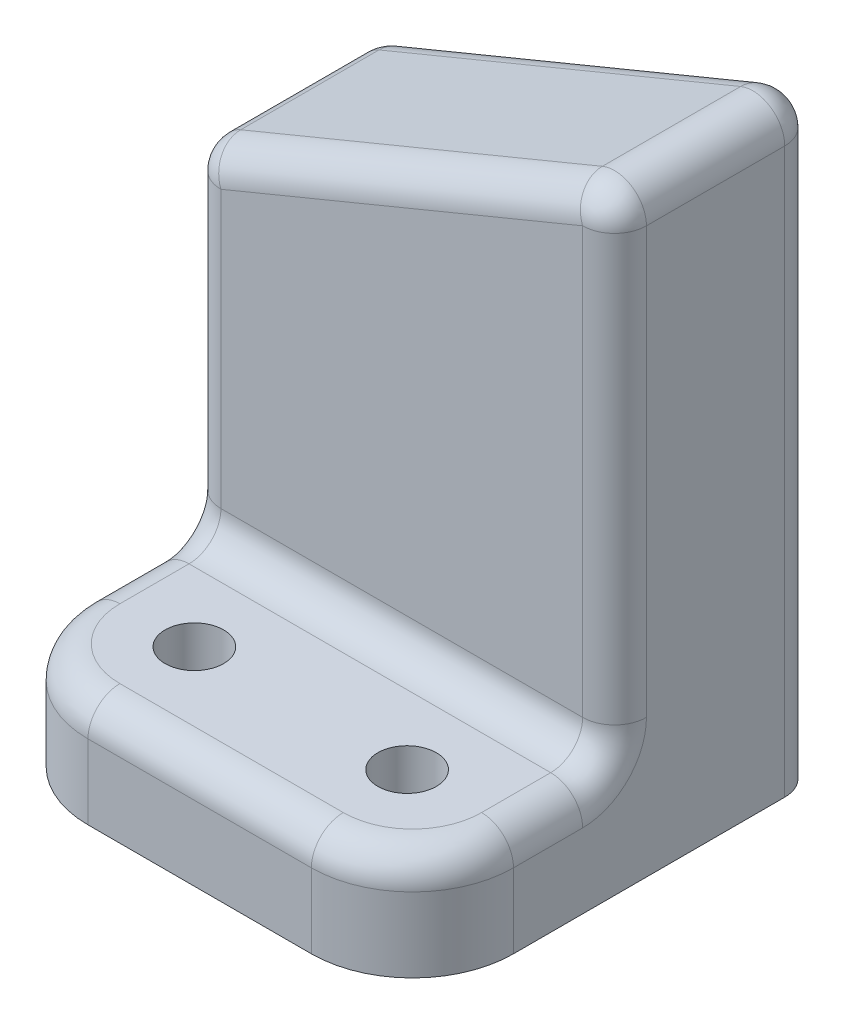
ISO-10303-21;
HEADER;
FILE_DESCRIPTION(('STEP AP214'),'2;1');
FILE_NAME('part.step','',(''),(''),'','','');
FILE_SCHEMA(('AUTOMOTIVE_DESIGN { 1 0 10303 214 1 1 1 1 }'));
ENDSEC;
DATA;
#1=APPLICATION_CONTEXT('core data for automotive mechanical design processes');
#2=APPLICATION_PROTOCOL_DEFINITION('international standard','automotive_design',2000,#1);
#3=PRODUCT_CONTEXT('',#1,'mechanical');
#4=PRODUCT('Part','Part','',(#3));
#5=PRODUCT_RELATED_PRODUCT_CATEGORY('part','',(#4));
#6=PRODUCT_DEFINITION_FORMATION('','',#4);
#7=PRODUCT_DEFINITION_CONTEXT('part definition',#1,'design');
#8=PRODUCT_DEFINITION('design','',#6,#7);
#9=PRODUCT_DEFINITION_SHAPE('','',#8);
#10=(LENGTH_UNIT() NAMED_UNIT(*) SI_UNIT(.MILLI.,.METRE.));
#11=(NAMED_UNIT(*) PLANE_ANGLE_UNIT() SI_UNIT($,.RADIAN.));
#12=(NAMED_UNIT(*) SI_UNIT($,.STERADIAN.) SOLID_ANGLE_UNIT());
#13=UNCERTAINTY_MEASURE_WITH_UNIT(LENGTH_MEASURE(1.E-05),#10,'distance_accuracy_value','');
#14=(GEOMETRIC_REPRESENTATION_CONTEXT(3) GLOBAL_UNCERTAINTY_ASSIGNED_CONTEXT((#13)) GLOBAL_UNIT_ASSIGNED_CONTEXT((#10,
#11,#12)) REPRESENTATION_CONTEXT('',''));
#15=CARTESIAN_POINT('',(0.,0.,0.));
#16=DIRECTION('',(0.,0.,1.));
#17=DIRECTION('',(1.,0.,0.));
#18=AXIS2_PLACEMENT_3D('',#15,#16,#17);
#19=CARTESIAN_POINT('',(20.,10.,19.));
#20=DIRECTION('',(0.,-1.,0.));
#21=DIRECTION('',(0.,0.,-1.));
#22=AXIS2_PLACEMENT_3D('',#19,#20,#21);
#23=PLANE('',#22);
#24=DIRECTION('',(-1.,0.,0.));
#25=VECTOR('',#24,1.);
#26=CARTESIAN_POINT('',(-20.,10.,22.));
#27=LINE('',#26,#25);
#28=CARTESIAN_POINT('',(17.,10.,22.));
#29=VERTEX_POINT('',#28);
#30=CARTESIAN_POINT('',(-17.,10.,22.));
#31=VERTEX_POINT('',#30);
#32=EDGE_CURVE('E215',#29,#31,#27,.T.);
#33=ORIENTED_EDGE('',*,*,#32,.T.);
#34=DIRECTION('',(0.,0.,1.));
#35=VECTOR('',#34,1.);
#36=CARTESIAN_POINT('',(-17.,10.,19.));
#37=LINE('',#36,#35);
#38=CARTESIAN_POINT('',(-17.,10.,28.5));
#39=VERTEX_POINT('',#38);
#40=EDGE_CURVE('E258',#31,#39,#37,.T.);
#41=ORIENTED_EDGE('',*,*,#40,.T.);
#42=CARTESIAN_POINT('',(-10.5,10.,28.5));
#43=DIRECTION('',(0.,-1.,0.));
#44=DIRECTION('',(0.,0.,-1.));
#45=AXIS2_PLACEMENT_3D('',#42,#43,#44);
#46=CIRCLE('',#45,6.5);
#47=CARTESIAN_POINT('',(-10.5,10.,35.));
#48=VERTEX_POINT('',#47);
#49=EDGE_CURVE('E256',#39,#48,#46,.F.);
#50=ORIENTED_EDGE('',*,*,#49,.T.);
#51=DIRECTION('',(-1.,0.,0.));
#52=VECTOR('',#51,1.);
#53=CARTESIAN_POINT('',(20.,10.,35.));
#54=LINE('',#53,#52);
#55=CARTESIAN_POINT('',(10.5,10.,35.));
#56=VERTEX_POINT('',#55);
#57=EDGE_CURVE('E254',#48,#56,#54,.F.);
#58=ORIENTED_EDGE('',*,*,#57,.T.);
#59=CARTESIAN_POINT('',(10.5,10.,28.5));
#60=DIRECTION('',(0.,-1.,0.));
#61=DIRECTION('',(0.,0.,-1.));
#62=AXIS2_PLACEMENT_3D('',#59,#60,#61);
#63=CIRCLE('',#62,6.5);
#64=CARTESIAN_POINT('',(17.,10.,28.5));
#65=VERTEX_POINT('',#64);
#66=EDGE_CURVE('E252',#56,#65,#63,.F.);
#67=ORIENTED_EDGE('',*,*,#66,.T.);
#68=DIRECTION('',(0.,0.,1.));
#69=VECTOR('',#68,1.);
#70=CARTESIAN_POINT('',(17.,10.,22.));
#71=LINE('',#70,#69);
#72=EDGE_CURVE('E250',#65,#29,#71,.F.);
#73=ORIENTED_EDGE('',*,*,#72,.T.);
#74=EDGE_LOOP('',(#33,#41,#50,#58,#67,#73));
#75=FACE_BOUND('',#74,.T.);
#76=CARTESIAN_POINT('',(10.,10.,28.5));
#77=DIRECTION('',(0.,1.,0.));
#78=DIRECTION('',(0.,0.,1.));
#79=AXIS2_PLACEMENT_3D('',#76,#77,#78);
#80=CIRCLE('',#79,2.75);
#81=CARTESIAN_POINT('',(10.,10.,31.25));
#82=VERTEX_POINT('',#81);
#83=EDGE_CURVE('E503',#82,#82,#80,.T.);
#84=ORIENTED_EDGE('',*,*,#83,.F.);
#85=EDGE_LOOP('',(#84));
#86=FACE_BOUND('',#85,.T.);
#87=CARTESIAN_POINT('',(-10.,10.,28.5));
#88=DIRECTION('',(0.,1.,0.));
#89=DIRECTION('',(0.,0.,1.));
#90=AXIS2_PLACEMENT_3D('',#87,#88,#89);
#91=CIRCLE('',#90,2.75);
#92=CARTESIAN_POINT('',(-10.,10.,31.25));
#93=VERTEX_POINT('',#92);
#94=EDGE_CURVE('E509',#93,#93,#91,.T.);
#95=ORIENTED_EDGE('',*,*,#94,.F.);
#96=EDGE_LOOP('',(#95));
#97=FACE_BOUND('',#96,.T.);
#98=ADVANCED_FACE('F34',(#75,#86,#97),#23,.F.);
#99=CARTESIAN_POINT('',(20.,0.,38.));
#100=DIRECTION('',(0.,1.,0.));
#101=DIRECTION('',(0.,0.,1.));
#102=AXIS2_PLACEMENT_3D('',#99,#100,#101);
#103=PLANE('',#102);
#104=CARTESIAN_POINT('',(-10.,0.,28.5));
#105=DIRECTION('',(0.,1.,0.));
#106=DIRECTION('',(0.,0.,1.));
#107=AXIS2_PLACEMENT_3D('',#104,#105,#106);
#108=CIRCLE('',#107,2.75);
#109=CARTESIAN_POINT('',(-10.,0.,31.25));
#110=VERTEX_POINT('',#109);
#111=EDGE_CURVE('E506',#110,#110,#108,.T.);
#112=ORIENTED_EDGE('',*,*,#111,.T.);
#113=EDGE_LOOP('',(#112));
#114=FACE_BOUND('',#113,.T.);
#115=CARTESIAN_POINT('',(10.,0.,28.5));
#116=DIRECTION('',(0.,1.,0.));
#117=DIRECTION('',(0.,0.,1.));
#118=AXIS2_PLACEMENT_3D('',#115,#116,#117);
#119=CIRCLE('',#118,2.75);
#120=CARTESIAN_POINT('',(10.,0.,31.25));
#121=VERTEX_POINT('',#120);
#122=EDGE_CURVE('E316',#121,#121,#119,.T.);
#123=ORIENTED_EDGE('',*,*,#122,.T.);
#124=EDGE_LOOP('',(#123));
#125=FACE_BOUND('',#124,.T.);
#126=DIRECTION('',(0.,0.,-1.));
#127=VECTOR('',#126,1.);
#128=CARTESIAN_POINT('',(-20.,0.,38.));
#129=LINE('',#128,#127);
#130=CARTESIAN_POINT('',(-20.,0.,28.5));
#131=VERTEX_POINT('',#130);
#132=CARTESIAN_POINT('',(-20.,0.,3.));
#133=VERTEX_POINT('',#132);
#134=EDGE_CURVE('E313',#131,#133,#129,.T.);
#135=ORIENTED_EDGE('',*,*,#134,.T.);
#136=CARTESIAN_POINT('',(-17.,0.,3.));
#137=DIRECTION('',(0.,1.,0.));
#138=DIRECTION('',(0.,0.,1.));
#139=AXIS2_PLACEMENT_3D('',#136,#137,#138);
#140=CIRCLE('',#139,3.);
#141=CARTESIAN_POINT('',(-17.,0.,0.));
#142=VERTEX_POINT('',#141);
#143=EDGE_CURVE('E11',#133,#142,#140,.F.);
#144=ORIENTED_EDGE('',*,*,#143,.T.);
#145=DIRECTION('',(-1.,0.,0.));
#146=VECTOR('',#145,1.);
#147=CARTESIAN_POINT('',(20.,0.,0.));
#148=LINE('',#147,#146);
#149=CARTESIAN_POINT('',(17.,0.,0.));
#150=VERTEX_POINT('',#149);
#151=EDGE_CURVE('E184',#150,#142,#148,.T.);
#152=ORIENTED_EDGE('',*,*,#151,.F.);
#153=CARTESIAN_POINT('',(17.,0.,3.));
#154=DIRECTION('',(0.,1.,0.));
#155=DIRECTION('',(0.,0.,1.));
#156=AXIS2_PLACEMENT_3D('',#153,#154,#155);
#157=CIRCLE('',#156,3.);
#158=CARTESIAN_POINT('',(20.,0.,3.));
#159=VERTEX_POINT('',#158);
#160=EDGE_CURVE('E43',#150,#159,#157,.F.);
#161=ORIENTED_EDGE('',*,*,#160,.T.);
#162=DIRECTION('',(0.,0.,-1.));
#163=VECTOR('',#162,1.);
#164=CARTESIAN_POINT('',(20.,0.,38.));
#165=LINE('',#164,#163);
#166=CARTESIAN_POINT('',(20.,0.,28.5));
#167=VERTEX_POINT('',#166);
#168=EDGE_CURVE('E170',#167,#159,#165,.T.);
#169=ORIENTED_EDGE('',*,*,#168,.F.);
#170=CARTESIAN_POINT('',(10.5,0.,28.5));
#171=DIRECTION('',(0.,1.,0.));
#172=DIRECTION('',(0.,0.,1.));
#173=AXIS2_PLACEMENT_3D('',#170,#171,#172);
#174=CIRCLE('',#173,9.5);
#175=CARTESIAN_POINT('',(10.5,0.,38.));
#176=VERTEX_POINT('',#175);
#177=EDGE_CURVE('E164',#167,#176,#174,.F.);
#178=ORIENTED_EDGE('',*,*,#177,.T.);
#179=DIRECTION('',(-1.,0.,0.));
#180=VECTOR('',#179,1.);
#181=CARTESIAN_POINT('',(20.,0.,38.));
#182=LINE('',#181,#180);
#183=CARTESIAN_POINT('',(-10.5,0.,38.));
#184=VERTEX_POINT('',#183);
#185=EDGE_CURVE('E168',#176,#184,#182,.T.);
#186=ORIENTED_EDGE('',*,*,#185,.T.);
#187=CARTESIAN_POINT('',(-10.5,0.,28.5));
#188=DIRECTION('',(0.,1.,0.));
#189=DIRECTION('',(0.,0.,1.));
#190=AXIS2_PLACEMENT_3D('',#187,#188,#189);
#191=CIRCLE('',#190,9.5);
#192=EDGE_CURVE('E174',#184,#131,#191,.F.);
#193=ORIENTED_EDGE('',*,*,#192,.T.);
#194=EDGE_LOOP('',(#135,#144,#152,#161,#169,#178,#186,#193));
#195=FACE_BOUND('',#194,.T.);
#196=ADVANCED_FACE('F167',(#114,#125,#195),#103,.F.);
#197=CARTESIAN_POINT('',(20.,0.,0.));
#198=DIRECTION('',(0.,0.,1.));
#199=DIRECTION('',(0.,-1.,0.));
#200=AXIS2_PLACEMENT_3D('',#197,#198,#199);
#201=PLANE('',#200);
#202=ORIENTED_EDGE('',*,*,#151,.T.);
#203=DIRECTION('',(0.,1.,0.));
#204=VECTOR('',#203,1.);
#205=CARTESIAN_POINT('',(-17.,0.,0.));
#206=LINE('',#205,#204);
#207=CARTESIAN_POINT('',(-17.,38.99228718,0.));
#208=VERTEX_POINT('',#207);
#209=EDGE_CURVE('E276',#142,#208,#206,.T.);
#210=ORIENTED_EDGE('',*,*,#209,.T.);
#211=DIRECTION('',(-0.924438601097928,-0.381330922952895,0.));
#212=VECTOR('',#211,1.);
#213=CARTESIAN_POINT('',(0.874263832928299,46.3654210110829,0.));
#214=LINE('',#213,#212);
#215=CARTESIAN_POINT('',(17.,53.01728718,0.));
#216=VERTEX_POINT('',#215);
#217=EDGE_CURVE('E59',#208,#216,#214,.F.);
#218=ORIENTED_EDGE('',*,*,#217,.T.);
#219=DIRECTION('',(0.,1.,0.));
#220=VECTOR('',#219,1.);
#221=CARTESIAN_POINT('',(17.,0.,0.));
#222=LINE('',#221,#220);
#223=EDGE_CURVE('E273',#216,#150,#222,.F.);
#224=ORIENTED_EDGE('',*,*,#223,.T.);
#225=EDGE_LOOP('',(#202,#210,#218,#224));
#226=FACE_BOUND('',#225,.T.);
#227=ADVANCED_FACE('F331',(#226),#201,.F.);
#228=CARTESIAN_POINT('',(20.,60.,19.));
#229=DIRECTION('',(0.,0.,-1.));
#230=DIRECTION('',(0.,1.,0.));
#231=AXIS2_PLACEMENT_3D('',#228,#229,#230);
#232=PLANE('',#231);
#233=DIRECTION('',(0.924438601097928,0.381330922952895,0.));
#234=VECTOR('',#233,1.);
#235=CARTESIAN_POINT('',(22.0252853311257,55.0902173790893,19.));
#236=LINE('',#235,#234);
#237=CARTESIAN_POINT('',(17.,53.01728718,19.));
#238=VERTEX_POINT('',#237);
#239=CARTESIAN_POINT('',(-17.,38.99228718,19.));
#240=VERTEX_POINT('',#239);
#241=EDGE_CURVE('E229',#238,#240,#236,.F.);
#242=ORIENTED_EDGE('',*,*,#241,.T.);
#243=DIRECTION('',(0.,-1.,0.));
#244=VECTOR('',#243,1.);
#245=CARTESIAN_POINT('',(-17.,60.,19.));
#246=LINE('',#245,#244);
#247=CARTESIAN_POINT('',(-17.,13.,19.));
#248=VERTEX_POINT('',#247);
#249=EDGE_CURVE('E232',#240,#248,#246,.T.);
#250=ORIENTED_EDGE('',*,*,#249,.T.);
#251=DIRECTION('',(-1.,0.,0.));
#252=VECTOR('',#251,1.);
#253=CARTESIAN_POINT('',(20.,13.,19.));
#254=LINE('',#253,#252);
#255=CARTESIAN_POINT('',(17.,13.,19.));
#256=VERTEX_POINT('',#255);
#257=EDGE_CURVE('E203',#248,#256,#254,.F.);
#258=ORIENTED_EDGE('',*,*,#257,.T.);
#259=DIRECTION('',(0.,-1.,0.));
#260=VECTOR('',#259,1.);
#261=CARTESIAN_POINT('',(17.,53.01728718,19.));
#262=LINE('',#261,#260);
#263=EDGE_CURVE('E227',#256,#238,#262,.F.);
#264=ORIENTED_EDGE('',*,*,#263,.T.);
#265=EDGE_LOOP('',(#242,#250,#258,#264));
#266=FACE_BOUND('',#265,.T.);
#267=ADVANCED_FACE('F360',(#266),#232,.F.);
#268=CARTESIAN_POINT('',(20.,10.,38.));
#269=DIRECTION('',(0.,0.,-1.));
#270=DIRECTION('',(-1.,0.,0.));
#271=AXIS2_PLACEMENT_3D('',#268,#269,#270);
#272=PLANE('',#271);
#273=DIRECTION('',(0.,-1.,0.));
#274=VECTOR('',#273,1.);
#275=CARTESIAN_POINT('',(10.5,10.,38.));
#276=LINE('',#275,#274);
#277=CARTESIAN_POINT('',(10.5,7.,38.));
#278=VERTEX_POINT('',#277);
#279=EDGE_CURVE('E180',#176,#278,#276,.F.);
#280=ORIENTED_EDGE('',*,*,#279,.T.);
#281=DIRECTION('',(-1.,0.,0.));
#282=VECTOR('',#281,1.);
#283=CARTESIAN_POINT('',(20.,7.,38.));
#284=LINE('',#283,#282);
#285=CARTESIAN_POINT('',(-10.5,7.,38.));
#286=VERTEX_POINT('',#285);
#287=EDGE_CURVE('E262',#278,#286,#284,.T.);
#288=ORIENTED_EDGE('',*,*,#287,.T.);
#289=DIRECTION('',(0.,-1.,0.));
#290=VECTOR('',#289,1.);
#291=CARTESIAN_POINT('',(-10.5,10.,38.));
#292=LINE('',#291,#290);
#293=EDGE_CURVE('E175',#286,#184,#292,.T.);
#294=ORIENTED_EDGE('',*,*,#293,.T.);
#295=ORIENTED_EDGE('',*,*,#185,.F.);
#296=EDGE_LOOP('',(#280,#288,#294,#295));
#297=FACE_BOUND('',#296,.T.);
#298=ADVANCED_FACE('F179',(#297),#272,.F.);
#299=CARTESIAN_POINT('',(20.,0.,0.));
#300=DIRECTION('',(1.,0.,0.));
#301=DIRECTION('',(0.,0.,-1.));
#302=AXIS2_PLACEMENT_3D('',#299,#300,#301);
#303=PLANE('',#302);
#304=CARTESIAN_POINT('',(20.,13.,22.));
#305=DIRECTION('',(1.,0.,0.));
#306=DIRECTION('',(0.,0.,-1.));
#307=AXIS2_PLACEMENT_3D('',#304,#305,#306);
#308=CIRCLE('',#307,6.);
#309=CARTESIAN_POINT('',(20.,13.,16.));
#310=VERTEX_POINT('',#309);
#311=CARTESIAN_POINT('',(20.,7.,22.));
#312=VERTEX_POINT('',#311);
#313=EDGE_CURVE('E269',#310,#312,#308,.F.);
#314=ORIENTED_EDGE('',*,*,#313,.T.);
#315=DIRECTION('',(0.,0.,1.));
#316=VECTOR('',#315,1.);
#317=CARTESIAN_POINT('',(20.,7.,28.5));
#318=LINE('',#317,#316);
#319=CARTESIAN_POINT('',(20.,7.,28.5));
#320=VERTEX_POINT('',#319);
#321=EDGE_CURVE('E271',#312,#320,#318,.T.);
#322=ORIENTED_EDGE('',*,*,#321,.T.);
#323=DIRECTION('',(0.,-1.,0.));
#324=VECTOR('',#323,1.);
#325=CARTESIAN_POINT('',(20.,0.,28.5));
#326=LINE('',#325,#324);
#327=EDGE_CURVE('E198',#320,#167,#326,.T.);
#328=ORIENTED_EDGE('',*,*,#327,.T.);
#329=ORIENTED_EDGE('',*,*,#168,.T.);
#330=DIRECTION('',(0.,1.,0.));
#331=VECTOR('',#330,1.);
#332=CARTESIAN_POINT('',(20.,53.01728718,3.));
#333=LINE('',#332,#331);
#334=CARTESIAN_POINT('',(20.,53.01728718,3.));
#335=VERTEX_POINT('',#334);
#336=EDGE_CURVE('E265',#159,#335,#333,.T.);
#337=ORIENTED_EDGE('',*,*,#336,.T.);
#338=DIRECTION('',(0.,0.,1.));
#339=VECTOR('',#338,1.);
#340=CARTESIAN_POINT('',(20.,53.01728718,19.));
#341=LINE('',#340,#339);
#342=CARTESIAN_POINT('',(20.,53.01728718,16.));
#343=VERTEX_POINT('',#342);
#344=EDGE_CURVE('E200',#335,#343,#341,.T.);
#345=ORIENTED_EDGE('',*,*,#344,.T.);
#346=DIRECTION('',(0.,-1.,0.));
#347=VECTOR('',#346,1.);
#348=CARTESIAN_POINT('',(20.,13.,16.));
#349=LINE('',#348,#347);
#350=EDGE_CURVE('E267',#343,#310,#349,.T.);
#351=ORIENTED_EDGE('',*,*,#350,.T.);
#352=EDGE_LOOP('',(#314,#322,#328,#329,#337,#345,#351));
#353=FACE_BOUND('',#352,.T.);
#354=ADVANCED_FACE('F453',(#353),#303,.T.);
#355=CARTESIAN_POINT('',(-20.,0.,0.));
#356=DIRECTION('',(1.,0.,0.));
#357=DIRECTION('',(0.,0.,-1.));
#358=AXIS2_PLACEMENT_3D('',#355,#356,#357);
#359=PLANE('',#358);
#360=CARTESIAN_POINT('',(-20.,13.,22.));
#361=DIRECTION('',(1.,0.,0.));
#362=DIRECTION('',(0.,0.,-1.));
#363=AXIS2_PLACEMENT_3D('',#360,#361,#362);
#364=CIRCLE('',#363,6.);
#365=CARTESIAN_POINT('',(-20.,7.,22.));
#366=VERTEX_POINT('',#365);
#367=CARTESIAN_POINT('',(-20.,13.,16.));
#368=VERTEX_POINT('',#367);
#369=EDGE_CURVE('E242',#366,#368,#364,.T.);
#370=ORIENTED_EDGE('',*,*,#369,.T.);
#371=DIRECTION('',(0.,-1.,0.));
#372=VECTOR('',#371,1.);
#373=CARTESIAN_POINT('',(-20.,0.,16.));
#374=LINE('',#373,#372);
#375=CARTESIAN_POINT('',(-20.,38.99228718,16.));
#376=VERTEX_POINT('',#375);
#377=EDGE_CURVE('E244',#368,#376,#374,.F.);
#378=ORIENTED_EDGE('',*,*,#377,.T.);
#379=DIRECTION('',(0.,0.,1.));
#380=VECTOR('',#379,1.);
#381=CARTESIAN_POINT('',(-20.,38.99228718,0.));
#382=LINE('',#381,#380);
#383=CARTESIAN_POINT('',(-20.,38.99228718,3.));
#384=VERTEX_POINT('',#383);
#385=EDGE_CURVE('E212',#376,#384,#382,.F.);
#386=ORIENTED_EDGE('',*,*,#385,.T.);
#387=DIRECTION('',(0.,1.,0.));
#388=VECTOR('',#387,1.);
#389=CARTESIAN_POINT('',(-20.,0.,3.));
#390=LINE('',#389,#388);
#391=EDGE_CURVE('E238',#384,#133,#390,.F.);
#392=ORIENTED_EDGE('',*,*,#391,.T.);
#393=ORIENTED_EDGE('',*,*,#134,.F.);
#394=DIRECTION('',(0.,-1.,0.));
#395=VECTOR('',#394,1.);
#396=CARTESIAN_POINT('',(-20.,0.,28.5));
#397=LINE('',#396,#395);
#398=CARTESIAN_POINT('',(-20.,7.,28.5));
#399=VERTEX_POINT('',#398);
#400=EDGE_CURVE('E195',#131,#399,#397,.F.);
#401=ORIENTED_EDGE('',*,*,#400,.T.);
#402=DIRECTION('',(0.,0.,1.));
#403=VECTOR('',#402,1.);
#404=CARTESIAN_POINT('',(-20.,7.,0.));
#405=LINE('',#404,#403);
#406=EDGE_CURVE('E240',#399,#366,#405,.F.);
#407=ORIENTED_EDGE('',*,*,#406,.T.);
#408=EDGE_LOOP('',(#370,#378,#386,#392,#393,#401,#407));
#409=FACE_BOUND('',#408,.T.);
#410=ADVANCED_FACE('F451',(#409),#359,.F.);
#411=CARTESIAN_POINT('',(25.5130671135382,59.7741401847825,38.001));
#412=DIRECTION('',(0.381330922952895,-0.924438601097928,0.));
#413=DIRECTION('',(0.924438601097928,0.381330922952895,0.));
#414=AXIS2_PLACEMENT_3D('',#411,#412,#413);
#415=PLANE('',#414);
#416=DIRECTION('',(0.,0.,1.));
#417=VECTOR('',#416,1.);
#418=CARTESIAN_POINT('',(-18.1439927688587,41.7656029832938,38.001));
#419=LINE('',#418,#417);
#420=CARTESIAN_POINT('',(-18.1439927688587,41.7656029832938,3.));
#421=VERTEX_POINT('',#420);
#422=CARTESIAN_POINT('',(-18.1439927688587,41.7656029832938,16.));
#423=VERTEX_POINT('',#422);
#424=EDGE_CURVE('E206',#421,#423,#419,.T.);
#425=ORIENTED_EDGE('',*,*,#424,.T.);
#426=DIRECTION('',(0.924438601097928,0.381330922952895,0.));
#427=VECTOR('',#426,1.);
#428=CARTESIAN_POINT('',(25.5130671135382,59.7741401847825,16.));
#429=LINE('',#428,#427);
#430=CARTESIAN_POINT('',(15.8560072311413,55.7906029832938,16.));
#431=VERTEX_POINT('',#430);
#432=EDGE_CURVE('E225',#423,#431,#429,.T.);
#433=ORIENTED_EDGE('',*,*,#432,.T.);
#434=DIRECTION('',(0.,0.,1.));
#435=VECTOR('',#434,1.);
#436=CARTESIAN_POINT('',(15.8560072311413,55.7906029832938,0.));
#437=LINE('',#436,#435);
#438=CARTESIAN_POINT('',(15.8560072311413,55.7906029832938,3.));
#439=VERTEX_POINT('',#438);
#440=EDGE_CURVE('E209',#431,#439,#437,.F.);
#441=ORIENTED_EDGE('',*,*,#440,.T.);
#442=DIRECTION('',(-0.924438601097928,-0.381330922952895,0.));
#443=VECTOR('',#442,1.);
#444=CARTESIAN_POINT('',(25.5130671135382,59.7741401847825,3.));
#445=LINE('',#444,#443);
#446=EDGE_CURVE('E223',#439,#421,#445,.T.);
#447=ORIENTED_EDGE('',*,*,#446,.T.);
#448=EDGE_LOOP('',(#425,#433,#441,#447));
#449=FACE_BOUND('',#448,.T.);
#450=ADVANCED_FACE('F369',(#449),#415,.F.);
#451=CARTESIAN_POINT('',(-10.5,10.,28.5));
#452=DIRECTION('',(0.,-1.,0.));
#453=DIRECTION('',(0.,0.,-1.));
#454=AXIS2_PLACEMENT_3D('',#451,#452,#453);
#455=CYLINDRICAL_SURFACE('',#454,9.5);
#456=ORIENTED_EDGE('',*,*,#293,.F.);
#457=CARTESIAN_POINT('',(-10.5,7.,28.5));
#458=DIRECTION('',(0.,-1.,0.));
#459=DIRECTION('',(0.,0.,-1.));
#460=AXIS2_PLACEMENT_3D('',#457,#458,#459);
#461=CIRCLE('',#460,9.5);
#462=EDGE_CURVE('E260',#286,#399,#461,.T.);
#463=ORIENTED_EDGE('',*,*,#462,.T.);
#464=ORIENTED_EDGE('',*,*,#400,.F.);
#465=ORIENTED_EDGE('',*,*,#192,.F.);
#466=EDGE_LOOP('',(#456,#463,#464,#465));
#467=FACE_BOUND('',#466,.T.);
#468=ADVANCED_FACE('F366',(#467),#455,.T.);
#469=CARTESIAN_POINT('',(10.5,0.,28.5));
#470=DIRECTION('',(0.,1.,0.));
#471=DIRECTION('',(0.,0.,1.));
#472=AXIS2_PLACEMENT_3D('',#469,#470,#471);
#473=CYLINDRICAL_SURFACE('',#472,9.5);
#474=ORIENTED_EDGE('',*,*,#327,.F.);
#475=CARTESIAN_POINT('',(10.5,7.,28.5));
#476=DIRECTION('',(0.,-1.,0.));
#477=DIRECTION('',(0.,0.,-1.));
#478=AXIS2_PLACEMENT_3D('',#475,#476,#477);
#479=CIRCLE('',#478,9.5);
#480=EDGE_CURVE('E188',#320,#278,#479,.T.);
#481=ORIENTED_EDGE('',*,*,#480,.T.);
#482=ORIENTED_EDGE('',*,*,#279,.F.);
#483=ORIENTED_EDGE('',*,*,#177,.F.);
#484=EDGE_LOOP('',(#474,#481,#482,#483));
#485=FACE_BOUND('',#484,.T.);
#486=ADVANCED_FACE('F186',(#485),#473,.T.);
#487=CARTESIAN_POINT('',(17.,53.01728718,0.));
#488=DIRECTION('',(0.,0.,-1.));
#489=DIRECTION('',(0.,1.,0.));
#490=AXIS2_PLACEMENT_3D('',#487,#488,#489);
#491=CYLINDRICAL_SURFACE('',#490,3.);
#492=ORIENTED_EDGE('',*,*,#440,.F.);
#493=CARTESIAN_POINT('',(17.,53.01728718,16.));
#494=DIRECTION('',(0.,0.,-1.));
#495=DIRECTION('',(0.,1.,0.));
#496=AXIS2_PLACEMENT_3D('',#493,#494,#495);
#497=CIRCLE('',#496,3.);
#498=EDGE_CURVE('E220',#431,#343,#497,.T.);
#499=ORIENTED_EDGE('',*,*,#498,.T.);
#500=ORIENTED_EDGE('',*,*,#344,.F.);
#501=CARTESIAN_POINT('',(17.,53.01728718,3.));
#502=DIRECTION('',(0.,0.,-1.));
#503=DIRECTION('',(0.,1.,0.));
#504=AXIS2_PLACEMENT_3D('',#501,#502,#503);
#505=CIRCLE('',#504,3.);
#506=EDGE_CURVE('E218',#335,#439,#505,.F.);
#507=ORIENTED_EDGE('',*,*,#506,.T.);
#508=EDGE_LOOP('',(#492,#499,#500,#507));
#509=FACE_BOUND('',#508,.T.);
#510=ADVANCED_FACE('F373',(#509),#491,.T.);
#511=CARTESIAN_POINT('',(-17.,38.99228718,38.001));
#512=DIRECTION('',(0.,0.,1.));
#513=DIRECTION('',(0.,-1.,0.));
#514=AXIS2_PLACEMENT_3D('',#511,#512,#513);
#515=CYLINDRICAL_SURFACE('',#514,3.);
#516=ORIENTED_EDGE('',*,*,#385,.F.);
#517=CARTESIAN_POINT('',(-17.,38.99228718,16.));
#518=DIRECTION('',(0.,0.,1.));
#519=DIRECTION('',(0.,-1.,0.));
#520=AXIS2_PLACEMENT_3D('',#517,#518,#519);
#521=CIRCLE('',#520,3.);
#522=EDGE_CURVE('E236',#376,#423,#521,.F.);
#523=ORIENTED_EDGE('',*,*,#522,.T.);
#524=ORIENTED_EDGE('',*,*,#424,.F.);
#525=CARTESIAN_POINT('',(-17.,38.99228718,3.));
#526=DIRECTION('',(0.,0.,1.));
#527=DIRECTION('',(0.,-1.,0.));
#528=AXIS2_PLACEMENT_3D('',#525,#526,#527);
#529=CIRCLE('',#528,3.);
#530=EDGE_CURVE('E234',#421,#384,#529,.T.);
#531=ORIENTED_EDGE('',*,*,#530,.T.);
#532=EDGE_LOOP('',(#516,#523,#524,#531));
#533=FACE_BOUND('',#532,.T.);
#534=ADVANCED_FACE('F376',(#533),#515,.T.);
#535=CARTESIAN_POINT('',(20.,13.,22.));
#536=DIRECTION('',(1.,0.,0.));
#537=DIRECTION('',(0.,0.,-1.));
#538=AXIS2_PLACEMENT_3D('',#535,#536,#537);
#539=CYLINDRICAL_SURFACE('',#538,3.);
#540=ORIENTED_EDGE('',*,*,#257,.F.);
#541=CARTESIAN_POINT('',(-17.,13.,22.));
#542=DIRECTION('',(1.,0.,0.));
#543=DIRECTION('',(0.,0.,-1.));
#544=AXIS2_PLACEMENT_3D('',#541,#542,#543);
#545=CIRCLE('',#544,3.);
#546=EDGE_CURVE('E248',#248,#31,#545,.F.);
#547=ORIENTED_EDGE('',*,*,#546,.T.);
#548=ORIENTED_EDGE('',*,*,#32,.F.);
#549=CARTESIAN_POINT('',(17.,13.,22.));
#550=DIRECTION('',(1.,0.,0.));
#551=DIRECTION('',(0.,0.,-1.));
#552=AXIS2_PLACEMENT_3D('',#549,#550,#551);
#553=CIRCLE('',#552,3.);
#554=EDGE_CURVE('E246',#29,#256,#553,.T.);
#555=ORIENTED_EDGE('',*,*,#554,.T.);
#556=EDGE_LOOP('',(#540,#547,#548,#555));
#557=FACE_BOUND('',#556,.T.);
#558=ADVANCED_FACE('F380',(#557),#539,.F.);
#559=CARTESIAN_POINT('',(-10.5,7.,28.5));
#560=DIRECTION('',(0.,-1.,0.));
#561=DIRECTION('',(0.,0.,-1.));
#562=AXIS2_PLACEMENT_3D('',#559,#560,#561);
#563=TOROIDAL_SURFACE('',#562,6.5,3.);
#564=CARTESIAN_POINT('',(-17.,7.,28.5));
#565=DIRECTION('',(0.,0.,-1.));
#566=DIRECTION('',(-1.,0.,0.));
#567=AXIS2_PLACEMENT_3D('',#564,#565,#566);
#568=CIRCLE('',#567,3.);
#569=EDGE_CURVE('E307',#399,#39,#568,.T.);
#570=ORIENTED_EDGE('',*,*,#569,.F.);
#571=ORIENTED_EDGE('',*,*,#462,.F.);
#572=CARTESIAN_POINT('',(-10.5,7.,35.));
#573=DIRECTION('',(1.,0.,0.));
#574=DIRECTION('',(0.,0.,-1.));
#575=AXIS2_PLACEMENT_3D('',#572,#573,#574);
#576=CIRCLE('',#575,3.);
#577=EDGE_CURVE('E310',#48,#286,#576,.T.);
#578=ORIENTED_EDGE('',*,*,#577,.F.);
#579=ORIENTED_EDGE('',*,*,#49,.F.);
#580=EDGE_LOOP('',(#570,#571,#578,#579));
#581=FACE_BOUND('',#580,.T.);
#582=ADVANCED_FACE('F384',(#581),#563,.T.);
#583=CARTESIAN_POINT('',(20.,7.,35.));
#584=DIRECTION('',(-1.,0.,0.));
#585=DIRECTION('',(0.,0.,1.));
#586=AXIS2_PLACEMENT_3D('',#583,#584,#585);
#587=CYLINDRICAL_SURFACE('',#586,3.);
#588=ORIENTED_EDGE('',*,*,#577,.T.);
#589=ORIENTED_EDGE('',*,*,#287,.F.);
#590=CARTESIAN_POINT('',(10.5,7.,35.));
#591=DIRECTION('',(1.,0.,0.));
#592=DIRECTION('',(0.,0.,-1.));
#593=AXIS2_PLACEMENT_3D('',#590,#591,#592);
#594=CIRCLE('',#593,3.);
#595=EDGE_CURVE('E304',#56,#278,#594,.T.);
#596=ORIENTED_EDGE('',*,*,#595,.F.);
#597=ORIENTED_EDGE('',*,*,#57,.F.);
#598=EDGE_LOOP('',(#588,#589,#596,#597));
#599=FACE_BOUND('',#598,.T.);
#600=ADVANCED_FACE('F425',(#599),#587,.T.);
#601=CARTESIAN_POINT('',(-17.,7.,19.));
#602=DIRECTION('',(0.,0.,1.));
#603=DIRECTION('',(0.,-1.,0.));
#604=AXIS2_PLACEMENT_3D('',#601,#602,#603);
#605=CYLINDRICAL_SURFACE('',#604,3.);
#606=ORIENTED_EDGE('',*,*,#569,.T.);
#607=ORIENTED_EDGE('',*,*,#40,.F.);
#608=CARTESIAN_POINT('',(-17.,7.,22.));
#609=DIRECTION('',(0.,0.,-1.));
#610=DIRECTION('',(-1.,0.,0.));
#611=AXIS2_PLACEMENT_3D('',#608,#609,#610);
#612=CIRCLE('',#611,3.);
#613=EDGE_CURVE('E301',#366,#31,#612,.T.);
#614=ORIENTED_EDGE('',*,*,#613,.F.);
#615=ORIENTED_EDGE('',*,*,#406,.F.);
#616=EDGE_LOOP('',(#606,#607,#614,#615));
#617=FACE_BOUND('',#616,.T.);
#618=ADVANCED_FACE('F421',(#617),#605,.T.);
#619=CARTESIAN_POINT('',(10.5,7.,28.5));
#620=DIRECTION('',(0.,-1.,0.));
#621=DIRECTION('',(0.,0.,-1.));
#622=AXIS2_PLACEMENT_3D('',#619,#620,#621);
#623=TOROIDAL_SURFACE('',#622,6.5,3.);
#624=ORIENTED_EDGE('',*,*,#595,.T.);
#625=ORIENTED_EDGE('',*,*,#480,.F.);
#626=CARTESIAN_POINT('',(17.,7.,28.5));
#627=DIRECTION('',(0.,0.,-1.));
#628=DIRECTION('',(-1.,0.,0.));
#629=AXIS2_PLACEMENT_3D('',#626,#627,#628);
#630=CIRCLE('',#629,3.);
#631=EDGE_CURVE('E298',#65,#320,#630,.T.);
#632=ORIENTED_EDGE('',*,*,#631,.F.);
#633=ORIENTED_EDGE('',*,*,#66,.F.);
#634=EDGE_LOOP('',(#624,#625,#632,#633));
#635=FACE_BOUND('',#634,.T.);
#636=ADVANCED_FACE('F417',(#635),#623,.T.);
#637=CARTESIAN_POINT('',(-17.,13.,22.));
#638=DIRECTION('',(1.,0.,0.));
#639=DIRECTION('',(0.,0.,-1.));
#640=AXIS2_PLACEMENT_3D('',#637,#638,#639);
#641=TOROIDAL_SURFACE('',#640,6.,3.);
#642=ORIENTED_EDGE('',*,*,#613,.T.);
#643=ORIENTED_EDGE('',*,*,#546,.F.);
#644=CARTESIAN_POINT('',(-17.,13.,16.));
#645=DIRECTION('',(0.,1.,0.));
#646=DIRECTION('',(0.,0.,1.));
#647=AXIS2_PLACEMENT_3D('',#644,#645,#646);
#648=CIRCLE('',#647,3.);
#649=EDGE_CURVE('E295',#368,#248,#648,.T.);
#650=ORIENTED_EDGE('',*,*,#649,.F.);
#651=ORIENTED_EDGE('',*,*,#369,.F.);
#652=EDGE_LOOP('',(#642,#643,#650,#651));
#653=FACE_BOUND('',#652,.T.);
#654=ADVANCED_FACE('F413',(#653),#641,.T.);
#655=CARTESIAN_POINT('',(17.,7.,0.));
#656=DIRECTION('',(0.,0.,-1.));
#657=DIRECTION('',(0.,1.,0.));
#658=AXIS2_PLACEMENT_3D('',#655,#656,#657);
#659=CYLINDRICAL_SURFACE('',#658,3.);
#660=ORIENTED_EDGE('',*,*,#631,.T.);
#661=ORIENTED_EDGE('',*,*,#321,.F.);
#662=CARTESIAN_POINT('',(17.,7.,22.));
#663=DIRECTION('',(0.,0.,-1.));
#664=DIRECTION('',(-1.,0.,0.));
#665=AXIS2_PLACEMENT_3D('',#662,#663,#664);
#666=CIRCLE('',#665,3.);
#667=EDGE_CURVE('E292',#29,#312,#666,.T.);
#668=ORIENTED_EDGE('',*,*,#667,.F.);
#669=ORIENTED_EDGE('',*,*,#72,.F.);
#670=EDGE_LOOP('',(#660,#661,#668,#669));
#671=FACE_BOUND('',#670,.T.);
#672=ADVANCED_FACE('F409',(#671),#659,.T.);
#673=CARTESIAN_POINT('',(-17.,60.,16.));
#674=DIRECTION('',(0.,-1.,0.));
#675=DIRECTION('',(0.,0.,-1.));
#676=AXIS2_PLACEMENT_3D('',#673,#674,#675);
#677=CYLINDRICAL_SURFACE('',#676,3.);
#678=ORIENTED_EDGE('',*,*,#649,.T.);
#679=ORIENTED_EDGE('',*,*,#249,.F.);
#680=CARTESIAN_POINT('',(-17.,38.99228718,16.));
#681=DIRECTION('',(0.,1.,0.));
#682=DIRECTION('',(0.,0.,1.));
#683=AXIS2_PLACEMENT_3D('',#680,#681,#682);
#684=CIRCLE('',#683,3.);
#685=EDGE_CURVE('E289',#376,#240,#684,.T.);
#686=ORIENTED_EDGE('',*,*,#685,.F.);
#687=ORIENTED_EDGE('',*,*,#377,.F.);
#688=EDGE_LOOP('',(#678,#679,#686,#687));
#689=FACE_BOUND('',#688,.T.);
#690=ADVANCED_FACE('F405',(#689),#677,.T.);
#691=CARTESIAN_POINT('',(17.,13.,22.));
#692=DIRECTION('',(1.,0.,0.));
#693=DIRECTION('',(0.,0.,-1.));
#694=AXIS2_PLACEMENT_3D('',#691,#692,#693);
#695=TOROIDAL_SURFACE('',#694,6.,3.);
#696=ORIENTED_EDGE('',*,*,#667,.T.);
#697=ORIENTED_EDGE('',*,*,#313,.F.);
#698=CARTESIAN_POINT('',(17.,13.,16.));
#699=DIRECTION('',(0.,1.,0.));
#700=DIRECTION('',(0.,0.,1.));
#701=AXIS2_PLACEMENT_3D('',#698,#699,#700);
#702=CIRCLE('',#701,3.);
#703=EDGE_CURVE('E286',#256,#310,#702,.T.);
#704=ORIENTED_EDGE('',*,*,#703,.F.);
#705=ORIENTED_EDGE('',*,*,#554,.F.);
#706=EDGE_LOOP('',(#696,#697,#704,#705));
#707=FACE_BOUND('',#706,.T.);
#708=ADVANCED_FACE('F401',(#707),#695,.T.);
#709=CARTESIAN_POINT('',(-17.,38.99228718,16.));
#710=DIRECTION('',(0.,0.,-1.));
#711=DIRECTION('',(0.,1.,0.));
#712=AXIS2_PLACEMENT_3D('',#709,#710,#711);
#713=SPHERICAL_SURFACE('',#712,3.);
#714=ORIENTED_EDGE('',*,*,#522,.F.);
#715=ORIENTED_EDGE('',*,*,#685,.T.);
#716=CARTESIAN_POINT('',(-17.,38.99228718,16.));
#717=DIRECTION('',(0.924438601097928,0.381330922952895,0.));
#718=DIRECTION('',(-0.381330922952895,0.924438601097928,0.));
#719=AXIS2_PLACEMENT_3D('',#716,#717,#718);
#720=CIRCLE('',#719,3.);
#721=EDGE_CURVE('E284',#423,#240,#720,.T.);
#722=ORIENTED_EDGE('',*,*,#721,.F.);
#723=EDGE_LOOP('',(#714,#715,#722));
#724=FACE_BOUND('',#723,.T.);
#725=ADVANCED_FACE('F397',(#724),#713,.T.);
#726=CARTESIAN_POINT('',(17.,0.,16.));
#727=DIRECTION('',(0.,1.,0.));
#728=DIRECTION('',(0.,0.,1.));
#729=AXIS2_PLACEMENT_3D('',#726,#727,#728);
#730=CYLINDRICAL_SURFACE('',#729,3.);
#731=ORIENTED_EDGE('',*,*,#703,.T.);
#732=ORIENTED_EDGE('',*,*,#350,.F.);
#733=CARTESIAN_POINT('',(17.,53.01728718,16.));
#734=DIRECTION('',(0.,1.,0.));
#735=DIRECTION('',(0.,0.,1.));
#736=AXIS2_PLACEMENT_3D('',#733,#734,#735);
#737=CIRCLE('',#736,3.);
#738=EDGE_CURVE('E282',#238,#343,#737,.T.);
#739=ORIENTED_EDGE('',*,*,#738,.F.);
#740=ORIENTED_EDGE('',*,*,#263,.F.);
#741=EDGE_LOOP('',(#731,#732,#739,#740));
#742=FACE_BOUND('',#741,.T.);
#743=ADVANCED_FACE('F393',(#742),#730,.T.);
#744=CARTESIAN_POINT('',(26.6570598823969,57.0008243814887,16.));
#745=DIRECTION('',(0.924438601097928,0.381330922952895,0.));
#746=DIRECTION('',(-0.381330922952895,0.924438601097928,0.));
#747=AXIS2_PLACEMENT_3D('',#744,#745,#746);
#748=CYLINDRICAL_SURFACE('',#747,3.);
#749=ORIENTED_EDGE('',*,*,#721,.T.);
#750=ORIENTED_EDGE('',*,*,#241,.F.);
#751=CARTESIAN_POINT('',(17.,53.01728718,16.));
#752=DIRECTION('',(0.924438601097928,0.381330922952895,0.));
#753=DIRECTION('',(-0.381330922952895,0.924438601097928,0.));
#754=AXIS2_PLACEMENT_3D('',#751,#752,#753);
#755=CIRCLE('',#754,3.);
#756=EDGE_CURVE('E279',#431,#238,#755,.T.);
#757=ORIENTED_EDGE('',*,*,#756,.F.);
#758=ORIENTED_EDGE('',*,*,#432,.F.);
#759=EDGE_LOOP('',(#749,#750,#757,#758));
#760=FACE_BOUND('',#759,.T.);
#761=ADVANCED_FACE('F389',(#760),#748,.T.);
#762=CARTESIAN_POINT('',(17.,53.01728718,16.));
#763=DIRECTION('',(0.,0.,-1.));
#764=DIRECTION('',(0.,1.,0.));
#765=AXIS2_PLACEMENT_3D('',#762,#763,#764);
#766=SPHERICAL_SURFACE('',#765,3.);
#767=ORIENTED_EDGE('',*,*,#738,.T.);
#768=ORIENTED_EDGE('',*,*,#498,.F.);
#769=ORIENTED_EDGE('',*,*,#756,.T.);
#770=EDGE_LOOP('',(#767,#768,#769));
#771=FACE_BOUND('',#770,.T.);
#772=ADVANCED_FACE('F386',(#771),#766,.T.);
#773=CARTESIAN_POINT('',(17.,0.,3.));
#774=DIRECTION('',(0.,-1.,0.));
#775=DIRECTION('',(0.,0.,-1.));
#776=AXIS2_PLACEMENT_3D('',#773,#774,#775);
#777=CYLINDRICAL_SURFACE('',#776,3.);
#778=CARTESIAN_POINT('',(17.,53.01728718,3.));
#779=DIRECTION('',(0.,1.,0.));
#780=DIRECTION('',(0.,0.,1.));
#781=AXIS2_PLACEMENT_3D('',#778,#779,#780);
#782=CIRCLE('',#781,3.);
#783=EDGE_CURVE('E38',#335,#216,#782,.T.);
#784=ORIENTED_EDGE('',*,*,#783,.F.);
#785=ORIENTED_EDGE('',*,*,#336,.F.);
#786=ORIENTED_EDGE('',*,*,#160,.F.);
#787=ORIENTED_EDGE('',*,*,#223,.F.);
#788=EDGE_LOOP('',(#784,#785,#786,#787));
#789=FACE_BOUND('',#788,.T.);
#790=ADVANCED_FACE('F36',(#789),#777,.T.);
#791=CARTESIAN_POINT('',(17.,53.01728718,3.));
#792=DIRECTION('',(0.,0.,1.));
#793=DIRECTION('',(0.,-1.,0.));
#794=AXIS2_PLACEMENT_3D('',#791,#792,#793);
#795=SPHERICAL_SURFACE('',#794,3.);
#796=ORIENTED_EDGE('',*,*,#506,.F.);
#797=ORIENTED_EDGE('',*,*,#783,.T.);
#798=CARTESIAN_POINT('',(17.,53.01728718,3.));
#799=DIRECTION('',(-0.924438601097928,-0.381330922952895,0.));
#800=DIRECTION('',(0.381330922952895,-0.924438601097928,0.));
#801=AXIS2_PLACEMENT_3D('',#798,#799,#800);
#802=CIRCLE('',#801,3.);
#803=EDGE_CURVE('E317',#439,#216,#802,.T.);
#804=ORIENTED_EDGE('',*,*,#803,.F.);
#805=EDGE_LOOP('',(#796,#797,#804));
#806=FACE_BOUND('',#805,.T.);
#807=ADVANCED_FACE('F326',(#806),#795,.T.);
#808=CARTESIAN_POINT('',(26.6570598823969,57.0008243814887,3.));
#809=DIRECTION('',(-0.924438601097928,-0.381330922952895,0.));
#810=DIRECTION('',(0.381330922952895,-0.924438601097928,0.));
#811=AXIS2_PLACEMENT_3D('',#808,#809,#810);
#812=CYLINDRICAL_SURFACE('',#811,3.);
#813=CARTESIAN_POINT('',(-17.,38.99228718,3.));
#814=DIRECTION('',(-0.924438601097928,-0.381330922952895,0.));
#815=DIRECTION('',(0.381330922952895,-0.924438601097928,0.));
#816=AXIS2_PLACEMENT_3D('',#813,#814,#815);
#817=CIRCLE('',#816,3.);
#818=EDGE_CURVE('E315',#421,#208,#817,.T.);
#819=ORIENTED_EDGE('',*,*,#818,.F.);
#820=ORIENTED_EDGE('',*,*,#446,.F.);
#821=ORIENTED_EDGE('',*,*,#803,.T.);
#822=ORIENTED_EDGE('',*,*,#217,.F.);
#823=EDGE_LOOP('',(#819,#820,#821,#822));
#824=FACE_BOUND('',#823,.T.);
#825=ADVANCED_FACE('F340',(#824),#812,.T.);
#826=CARTESIAN_POINT('',(-17.,38.99228718,3.));
#827=DIRECTION('',(0.,0.,1.));
#828=DIRECTION('',(0.,-1.,0.));
#829=AXIS2_PLACEMENT_3D('',#826,#827,#828);
#830=SPHERICAL_SURFACE('',#829,3.);
#831=ORIENTED_EDGE('',*,*,#530,.F.);
#832=ORIENTED_EDGE('',*,*,#818,.T.);
#833=CARTESIAN_POINT('',(-17.,38.99228718,3.));
#834=DIRECTION('',(0.,-1.,0.));
#835=DIRECTION('',(0.,0.,-1.));
#836=AXIS2_PLACEMENT_3D('',#833,#834,#835);
#837=CIRCLE('',#836,3.);
#838=EDGE_CURVE('E51',#384,#208,#837,.T.);
#839=ORIENTED_EDGE('',*,*,#838,.F.);
#840=EDGE_LOOP('',(#831,#832,#839));
#841=FACE_BOUND('',#840,.T.);
#842=ADVANCED_FACE('F338',(#841),#830,.T.);
#843=CARTESIAN_POINT('',(-17.,0.,3.));
#844=DIRECTION('',(0.,1.,0.));
#845=DIRECTION('',(0.,0.,1.));
#846=AXIS2_PLACEMENT_3D('',#843,#844,#845);
#847=CYLINDRICAL_SURFACE('',#846,3.);
#848=ORIENTED_EDGE('',*,*,#143,.F.);
#849=ORIENTED_EDGE('',*,*,#391,.F.);
#850=ORIENTED_EDGE('',*,*,#838,.T.);
#851=ORIENTED_EDGE('',*,*,#209,.F.);
#852=EDGE_LOOP('',(#848,#849,#850,#851));
#853=FACE_BOUND('',#852,.T.);
#854=ADVANCED_FACE('F334',(#853),#847,.T.);
#855=CARTESIAN_POINT('',(10.,10.,28.5));
#856=DIRECTION('',(0.,1.,0.));
#857=DIRECTION('',(0.,0.,1.));
#858=AXIS2_PLACEMENT_3D('',#855,#856,#857);
#859=CYLINDRICAL_SURFACE('',#858,2.75);
#860=ORIENTED_EDGE('',*,*,#122,.F.);
#861=EDGE_LOOP('',(#860));
#862=FACE_BOUND('',#861,.T.);
#863=ORIENTED_EDGE('',*,*,#83,.T.);
#864=EDGE_LOOP('',(#863));
#865=FACE_BOUND('',#864,.T.);
#866=ADVANCED_FACE('F434',(#862,#865),#859,.F.);
#867=CARTESIAN_POINT('',(-10.,10.,28.5));
#868=DIRECTION('',(0.,1.,0.));
#869=DIRECTION('',(0.,0.,1.));
#870=AXIS2_PLACEMENT_3D('',#867,#868,#869);
#871=CYLINDRICAL_SURFACE('',#870,2.75);
#872=ORIENTED_EDGE('',*,*,#111,.F.);
#873=EDGE_LOOP('',(#872));
#874=FACE_BOUND('',#873,.T.);
#875=ORIENTED_EDGE('',*,*,#94,.T.);
#876=EDGE_LOOP('',(#875));
#877=FACE_BOUND('',#876,.T.);
#878=ADVANCED_FACE('F438',(#874,#877),#871,.F.);
#879=CLOSED_SHELL('',(#98,#196,#227,#267,#298,#354,#410,#450,#468,#486,#510,#534,#558,#582,#600,
#618,#636,#654,#672,#690,#708,#725,#743,#761,#772,#790,#807,#825,#842,#854,#866,#878));
#880=MANIFOLD_SOLID_BREP('B2',#879);
#881=ADVANCED_BREP_SHAPE_REPRESENTATION('',(#18,#880),#14);
#882=SHAPE_DEFINITION_REPRESENTATION(#9,#881);
ENDSEC;
END-ISO-10303-21;
